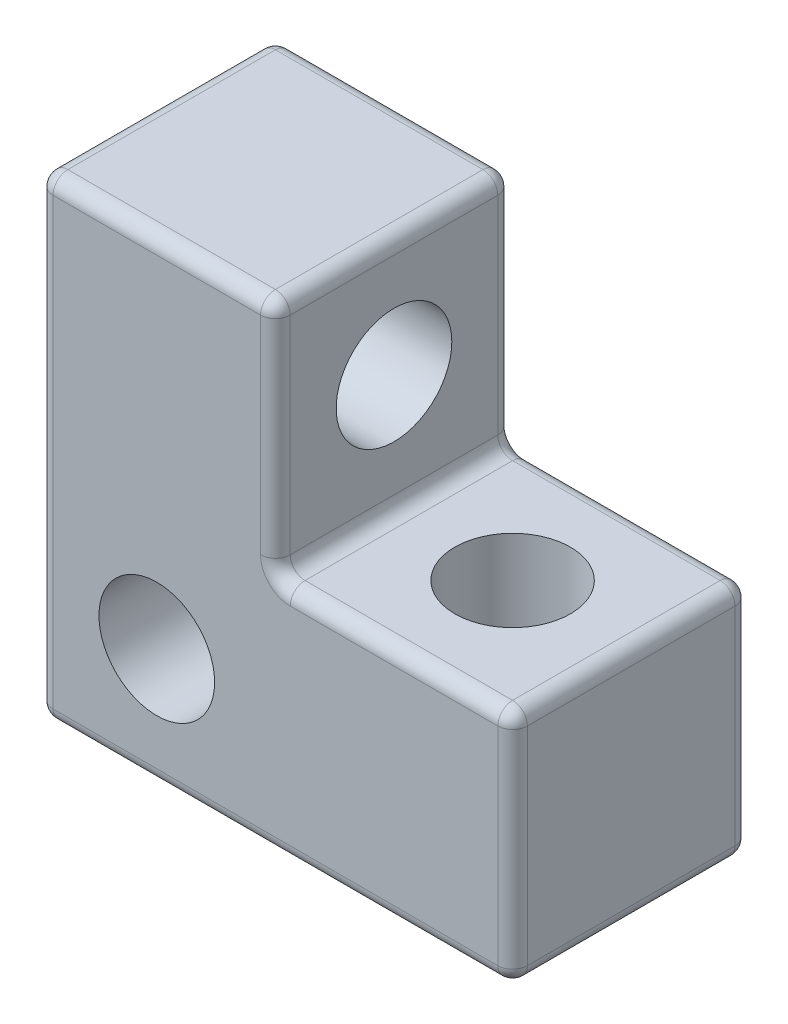
ISO-10303-21;
HEADER;
FILE_DESCRIPTION(('STEP AP214'),'2;1');
FILE_NAME('part.step','',(''),(''),'','','');
FILE_SCHEMA(('AUTOMOTIVE_DESIGN { 1 0 10303 214 1 1 1 1 }'));
ENDSEC;
DATA;
#1=APPLICATION_CONTEXT('core data for automotive mechanical design processes');
#2=APPLICATION_PROTOCOL_DEFINITION('international standard','automotive_design',2000,#1);
#3=PRODUCT_CONTEXT('',#1,'mechanical');
#4=PRODUCT('Part','Part','',(#3));
#5=PRODUCT_RELATED_PRODUCT_CATEGORY('part','',(#4));
#6=PRODUCT_DEFINITION_FORMATION('','',#4);
#7=PRODUCT_DEFINITION_CONTEXT('part definition',#1,'design');
#8=PRODUCT_DEFINITION('design','',#6,#7);
#9=PRODUCT_DEFINITION_SHAPE('','',#8);
#10=(LENGTH_UNIT() NAMED_UNIT(*) SI_UNIT(.MILLI.,.METRE.));
#11=(NAMED_UNIT(*) PLANE_ANGLE_UNIT() SI_UNIT($,.RADIAN.));
#12=(NAMED_UNIT(*) SI_UNIT($,.STERADIAN.) SOLID_ANGLE_UNIT());
#13=UNCERTAINTY_MEASURE_WITH_UNIT(LENGTH_MEASURE(1.E-05),#10,'distance_accuracy_value','');
#14=(GEOMETRIC_REPRESENTATION_CONTEXT(3) GLOBAL_UNCERTAINTY_ASSIGNED_CONTEXT((#13)) GLOBAL_UNIT_ASSIGNED_CONTEXT((#10,
#11,#12)) REPRESENTATION_CONTEXT('',''));
#15=CARTESIAN_POINT('',(0.,0.,0.));
#16=DIRECTION('',(0.,0.,1.));
#17=DIRECTION('',(1.,0.,0.));
#18=AXIS2_PLACEMENT_3D('',#15,#16,#17);
#19=CARTESIAN_POINT('',(0.,0.,8.));
#20=DIRECTION('',(0.,0.,-1.));
#21=DIRECTION('',(-1.,0.,0.));
#22=AXIS2_PLACEMENT_3D('',#19,#20,#21);
#23=PLANE('',#22);
#24=CARTESIAN_POINT('',(-4.,-4.,8.));
#25=DIRECTION('',(0.,0.,1.));
#26=DIRECTION('',(1.,0.,0.));
#27=AXIS2_PLACEMENT_3D('',#24,#25,#26);
#28=CIRCLE('',#27,1.95);
#29=CARTESIAN_POINT('',(-2.05,-4.,8.));
#30=VERTEX_POINT('',#29);
#31=EDGE_CURVE('E387',#30,#30,#28,.T.);
#32=ORIENTED_EDGE('',*,*,#31,.F.);
#33=EDGE_LOOP('',(#32));
#34=FACE_BOUND('',#33,.T.);
#35=CARTESIAN_POINT('',(0.5,0.5,8.));
#36=DIRECTION('',(0.,0.,-1.));
#37=DIRECTION('',(-1.,0.,0.));
#38=AXIS2_PLACEMENT_3D('',#35,#36,#37);
#39=CIRCLE('',#38,1.);
#40=CARTESIAN_POINT('',(-0.5,0.5,8.));
#41=VERTEX_POINT('',#40);
#42=CARTESIAN_POINT('',(0.5,-0.5,8.));
#43=VERTEX_POINT('',#42);
#44=EDGE_CURVE('E232',#41,#43,#39,.F.);
#45=ORIENTED_EDGE('',*,*,#44,.F.);
#46=DIRECTION('',(0.,1.,0.));
#47=VECTOR('',#46,1.);
#48=CARTESIAN_POINT('',(-0.5,0.,8.));
#49=LINE('',#48,#47);
#50=CARTESIAN_POINT('',(-0.5,7.5,8.));
#51=VERTEX_POINT('',#50);
#52=EDGE_CURVE('E230',#41,#51,#49,.T.);
#53=ORIENTED_EDGE('',*,*,#52,.T.);
#54=DIRECTION('',(-1.,0.,0.));
#55=VECTOR('',#54,1.);
#56=CARTESIAN_POINT('',(0.,7.5,8.));
#57=LINE('',#56,#55);
#58=CARTESIAN_POINT('',(-7.5,7.5,8.));
#59=VERTEX_POINT('',#58);
#60=EDGE_CURVE('E225',#51,#59,#57,.T.);
#61=ORIENTED_EDGE('',*,*,#60,.T.);
#62=DIRECTION('',(0.,-1.,0.));
#63=VECTOR('',#62,1.);
#64=CARTESIAN_POINT('',(-7.5,0.,8.));
#65=LINE('',#64,#63);
#66=CARTESIAN_POINT('',(-7.5,-7.5,8.));
#67=VERTEX_POINT('',#66);
#68=EDGE_CURVE('E221',#59,#67,#65,.T.);
#69=ORIENTED_EDGE('',*,*,#68,.T.);
#70=DIRECTION('',(1.,0.,0.));
#71=VECTOR('',#70,1.);
#72=CARTESIAN_POINT('',(0.,-7.5,8.));
#73=LINE('',#72,#71);
#74=CARTESIAN_POINT('',(7.5,-7.5,8.));
#75=VERTEX_POINT('',#74);
#76=EDGE_CURVE('E219',#67,#75,#73,.T.);
#77=ORIENTED_EDGE('',*,*,#76,.T.);
#78=DIRECTION('',(0.,1.,0.));
#79=VECTOR('',#78,1.);
#80=CARTESIAN_POINT('',(7.5,0.,8.));
#81=LINE('',#80,#79);
#82=CARTESIAN_POINT('',(7.5,-0.500000000000001,8.));
#83=VERTEX_POINT('',#82);
#84=EDGE_CURVE('E223',#75,#83,#81,.T.);
#85=ORIENTED_EDGE('',*,*,#84,.T.);
#86=DIRECTION('',(-1.,0.,0.));
#87=VECTOR('',#86,1.);
#88=CARTESIAN_POINT('',(0.,-0.5,8.));
#89=LINE('',#88,#87);
#90=EDGE_CURVE('E227',#83,#43,#89,.T.);
#91=ORIENTED_EDGE('',*,*,#90,.T.);
#92=EDGE_LOOP('',(#45,#53,#61,#69,#77,#85,#91));
#93=FACE_BOUND('',#92,.T.);
#94=ADVANCED_FACE('F33',(#34,#93),#23,.F.);
#95=CARTESIAN_POINT('',(8.,0.,8.));
#96=DIRECTION('',(0.,-1.,0.));
#97=DIRECTION('',(1.,0.,0.));
#98=AXIS2_PLACEMENT_3D('',#95,#96,#97);
#99=PLANE('',#98);
#100=DIRECTION('',(-1.,0.,0.));
#101=VECTOR('',#100,1.);
#102=CARTESIAN_POINT('',(8.,0.,7.5));
#103=LINE('',#102,#101);
#104=CARTESIAN_POINT('',(0.5,0.,7.5));
#105=VERTEX_POINT('',#104);
#106=CARTESIAN_POINT('',(7.5,0.,7.5));
#107=VERTEX_POINT('',#106);
#108=EDGE_CURVE('E194',#105,#107,#103,.F.);
#109=ORIENTED_EDGE('',*,*,#108,.T.);
#110=DIRECTION('',(0.,0.,-1.));
#111=VECTOR('',#110,1.);
#112=CARTESIAN_POINT('',(7.5,0.,8.));
#113=LINE('',#112,#111);
#114=CARTESIAN_POINT('',(7.5,0.,0.5));
#115=VERTEX_POINT('',#114);
#116=EDGE_CURVE('E200',#107,#115,#113,.T.);
#117=ORIENTED_EDGE('',*,*,#116,.T.);
#118=DIRECTION('',(-1.,0.,0.));
#119=VECTOR('',#118,1.);
#120=CARTESIAN_POINT('',(0.,0.,0.5));
#121=LINE('',#120,#119);
#122=CARTESIAN_POINT('',(0.5,0.,0.5));
#123=VERTEX_POINT('',#122);
#124=EDGE_CURVE('E169',#115,#123,#121,.T.);
#125=ORIENTED_EDGE('',*,*,#124,.T.);
#126=DIRECTION('',(0.,0.,-1.));
#127=VECTOR('',#126,1.);
#128=CARTESIAN_POINT('',(0.5,0.,8.));
#129=LINE('',#128,#127);
#130=EDGE_CURVE('E188',#123,#105,#129,.F.);
#131=ORIENTED_EDGE('',*,*,#130,.T.);
#132=EDGE_LOOP('',(#109,#117,#125,#131));
#133=FACE_BOUND('',#132,.T.);
#134=CARTESIAN_POINT('',(4.,0.,4.));
#135=DIRECTION('',(0.,1.,0.));
#136=DIRECTION('',(0.,0.,1.));
#137=AXIS2_PLACEMENT_3D('',#134,#135,#136);
#138=CIRCLE('',#137,1.95);
#139=CARTESIAN_POINT('',(4.,0.,5.95));
#140=VERTEX_POINT('',#139);
#141=EDGE_CURVE('E399',#140,#140,#138,.T.);
#142=ORIENTED_EDGE('',*,*,#141,.F.);
#143=EDGE_LOOP('',(#142));
#144=FACE_BOUND('',#143,.T.);
#145=ADVANCED_FACE('F197',(#133,#144),#99,.F.);
#146=CARTESIAN_POINT('',(0.,0.,8.));
#147=DIRECTION('',(-1.,0.,0.));
#148=DIRECTION('',(0.,0.,1.));
#149=AXIS2_PLACEMENT_3D('',#146,#147,#148);
#150=PLANE('',#149);
#151=DIRECTION('',(0.,1.,0.));
#152=VECTOR('',#151,1.);
#153=CARTESIAN_POINT('',(0.,8.,0.5));
#154=LINE('',#153,#152);
#155=CARTESIAN_POINT('',(0.,0.5,0.5));
#156=VERTEX_POINT('',#155);
#157=CARTESIAN_POINT('',(0.,7.5,0.5));
#158=VERTEX_POINT('',#157);
#159=EDGE_CURVE('E247',#156,#158,#154,.T.);
#160=ORIENTED_EDGE('',*,*,#159,.T.);
#161=DIRECTION('',(0.,0.,-1.));
#162=VECTOR('',#161,1.);
#163=CARTESIAN_POINT('',(0.,7.5,8.));
#164=LINE('',#163,#162);
#165=CARTESIAN_POINT('',(0.,7.5,7.5));
#166=VERTEX_POINT('',#165);
#167=EDGE_CURVE('E249',#158,#166,#164,.F.);
#168=ORIENTED_EDGE('',*,*,#167,.T.);
#169=DIRECTION('',(0.,1.,0.));
#170=VECTOR('',#169,1.);
#171=CARTESIAN_POINT('',(0.,0.,7.5));
#172=LINE('',#171,#170);
#173=CARTESIAN_POINT('',(0.,0.5,7.5));
#174=VERTEX_POINT('',#173);
#175=EDGE_CURVE('E245',#166,#174,#172,.F.);
#176=ORIENTED_EDGE('',*,*,#175,.T.);
#177=DIRECTION('',(0.,0.,-1.));
#178=VECTOR('',#177,1.);
#179=CARTESIAN_POINT('',(0.,0.5,0.));
#180=LINE('',#179,#178);
#181=EDGE_CURVE('E243',#174,#156,#180,.T.);
#182=ORIENTED_EDGE('',*,*,#181,.T.);
#183=EDGE_LOOP('',(#160,#168,#176,#182));
#184=FACE_BOUND('',#183,.T.);
#185=CARTESIAN_POINT('',(0.,4.,4.));
#186=DIRECTION('',(1.,0.,0.));
#187=DIRECTION('',(0.,0.,-1.));
#188=AXIS2_PLACEMENT_3D('',#185,#186,#187);
#189=CIRCLE('',#188,1.95);
#190=CARTESIAN_POINT('',(0.,4.,2.05));
#191=VERTEX_POINT('',#190);
#192=EDGE_CURVE('E393',#191,#191,#189,.T.);
#193=ORIENTED_EDGE('',*,*,#192,.F.);
#194=EDGE_LOOP('',(#193));
#195=FACE_BOUND('',#194,.T.);
#196=ADVANCED_FACE('F434',(#184,#195),#150,.F.);
#197=CARTESIAN_POINT('',(0.,8.,8.));
#198=DIRECTION('',(0.,-1.,0.));
#199=DIRECTION('',(1.,0.,0.));
#200=AXIS2_PLACEMENT_3D('',#197,#198,#199);
#201=PLANE('',#200);
#202=DIRECTION('',(-1.,0.,0.));
#203=VECTOR('',#202,1.);
#204=CARTESIAN_POINT('',(0.,8.,7.5));
#205=LINE('',#204,#203);
#206=CARTESIAN_POINT('',(-7.5,8.,7.5));
#207=VERTEX_POINT('',#206);
#208=CARTESIAN_POINT('',(-0.5,8.,7.5));
#209=VERTEX_POINT('',#208);
#210=EDGE_CURVE('E238',#207,#209,#205,.F.);
#211=ORIENTED_EDGE('',*,*,#210,.T.);
#212=DIRECTION('',(0.,0.,-1.));
#213=VECTOR('',#212,1.);
#214=CARTESIAN_POINT('',(-0.5,8.,8.));
#215=LINE('',#214,#213);
#216=CARTESIAN_POINT('',(-0.5,8.,0.5));
#217=VERTEX_POINT('',#216);
#218=EDGE_CURVE('E240',#209,#217,#215,.T.);
#219=ORIENTED_EDGE('',*,*,#218,.T.);
#220=DIRECTION('',(-1.,0.,0.));
#221=VECTOR('',#220,1.);
#222=CARTESIAN_POINT('',(-8.,8.,0.5));
#223=LINE('',#222,#221);
#224=CARTESIAN_POINT('',(-7.5,8.,0.5));
#225=VERTEX_POINT('',#224);
#226=EDGE_CURVE('E234',#217,#225,#223,.T.);
#227=ORIENTED_EDGE('',*,*,#226,.T.);
#228=DIRECTION('',(0.,0.,-1.));
#229=VECTOR('',#228,1.);
#230=CARTESIAN_POINT('',(-7.5,8.,8.));
#231=LINE('',#230,#229);
#232=EDGE_CURVE('E236',#225,#207,#231,.F.);
#233=ORIENTED_EDGE('',*,*,#232,.T.);
#234=EDGE_LOOP('',(#211,#219,#227,#233));
#235=FACE_BOUND('',#234,.T.);
#236=ADVANCED_FACE('F456',(#235),#201,.F.);
#237=CARTESIAN_POINT('',(-8.,8.,8.));
#238=DIRECTION('',(1.,0.,0.));
#239=DIRECTION('',(0.,1.,0.));
#240=AXIS2_PLACEMENT_3D('',#237,#238,#239);
#241=PLANE('',#240);
#242=DIRECTION('',(0.,0.,-1.));
#243=VECTOR('',#242,1.);
#244=CARTESIAN_POINT('',(-8.,7.5,8.));
#245=LINE('',#244,#243);
#246=CARTESIAN_POINT('',(-8.,7.5,7.5));
#247=VERTEX_POINT('',#246);
#248=CARTESIAN_POINT('',(-8.,7.5,0.5));
#249=VERTEX_POINT('',#248);
#250=EDGE_CURVE('E256',#247,#249,#245,.T.);
#251=ORIENTED_EDGE('',*,*,#250,.T.);
#252=DIRECTION('',(0.,-1.,0.));
#253=VECTOR('',#252,1.);
#254=CARTESIAN_POINT('',(-8.,-8.,0.5));
#255=LINE('',#254,#253);
#256=CARTESIAN_POINT('',(-8.,-7.5,0.5));
#257=VERTEX_POINT('',#256);
#258=EDGE_CURVE('E259',#249,#257,#255,.T.);
#259=ORIENTED_EDGE('',*,*,#258,.T.);
#260=DIRECTION('',(0.,0.,-1.));
#261=VECTOR('',#260,1.);
#262=CARTESIAN_POINT('',(-8.,-7.5,8.));
#263=LINE('',#262,#261);
#264=CARTESIAN_POINT('',(-8.,-7.5,7.5));
#265=VERTEX_POINT('',#264);
#266=EDGE_CURVE('E254',#257,#265,#263,.F.);
#267=ORIENTED_EDGE('',*,*,#266,.T.);
#268=DIRECTION('',(0.,-1.,0.));
#269=VECTOR('',#268,1.);
#270=CARTESIAN_POINT('',(-8.,8.,7.5));
#271=LINE('',#270,#269);
#272=EDGE_CURVE('E252',#265,#247,#271,.F.);
#273=ORIENTED_EDGE('',*,*,#272,.T.);
#274=EDGE_LOOP('',(#251,#259,#267,#273));
#275=FACE_BOUND('',#274,.T.);
#276=CARTESIAN_POINT('',(-8.,4.,4.));
#277=DIRECTION('',(1.,0.,0.));
#278=DIRECTION('',(0.,0.,-1.));
#279=AXIS2_PLACEMENT_3D('',#276,#277,#278);
#280=CIRCLE('',#279,1.7);
#281=CARTESIAN_POINT('',(-8.,4.,2.3));
#282=VERTEX_POINT('',#281);
#283=EDGE_CURVE('E377',#282,#282,#280,.T.);
#284=ORIENTED_EDGE('',*,*,#283,.T.);
#285=EDGE_LOOP('',(#284));
#286=FACE_BOUND('',#285,.T.);
#287=ADVANCED_FACE('F453',(#275,#286),#241,.F.);
#288=CARTESIAN_POINT('',(-8.,-8.,8.));
#289=DIRECTION('',(0.,1.,0.));
#290=DIRECTION('',(0.,0.,1.));
#291=AXIS2_PLACEMENT_3D('',#288,#289,#290);
#292=PLANE('',#291);
#293=DIRECTION('',(0.,0.,-1.));
#294=VECTOR('',#293,1.);
#295=CARTESIAN_POINT('',(-7.5,-8.,8.));
#296=LINE('',#295,#294);
#297=CARTESIAN_POINT('',(-7.5,-8.,7.5));
#298=VERTEX_POINT('',#297);
#299=CARTESIAN_POINT('',(-7.5,-8.,0.5));
#300=VERTEX_POINT('',#299);
#301=EDGE_CURVE('E53',#298,#300,#296,.T.);
#302=ORIENTED_EDGE('',*,*,#301,.T.);
#303=DIRECTION('',(1.,0.,0.));
#304=VECTOR('',#303,1.);
#305=CARTESIAN_POINT('',(8.,-8.,0.5));
#306=LINE('',#305,#304);
#307=CARTESIAN_POINT('',(7.5,-8.,0.5));
#308=VERTEX_POINT('',#307);
#309=EDGE_CURVE('E11',#300,#308,#306,.T.);
#310=ORIENTED_EDGE('',*,*,#309,.T.);
#311=DIRECTION('',(0.,0.,-1.));
#312=VECTOR('',#311,1.);
#313=CARTESIAN_POINT('',(7.5,-8.,8.));
#314=LINE('',#313,#312);
#315=CARTESIAN_POINT('',(7.5,-8.,7.5));
#316=VERTEX_POINT('',#315);
#317=EDGE_CURVE('E42',#308,#316,#314,.F.);
#318=ORIENTED_EDGE('',*,*,#317,.T.);
#319=DIRECTION('',(1.,0.,0.));
#320=VECTOR('',#319,1.);
#321=CARTESIAN_POINT('',(-8.,-8.,7.5));
#322=LINE('',#321,#320);
#323=EDGE_CURVE('E270',#316,#298,#322,.F.);
#324=ORIENTED_EDGE('',*,*,#323,.T.);
#325=EDGE_LOOP('',(#302,#310,#318,#324));
#326=FACE_BOUND('',#325,.T.);
#327=CARTESIAN_POINT('',(4.,-8.,4.));
#328=DIRECTION('',(0.,1.,0.));
#329=DIRECTION('',(0.,0.,1.));
#330=AXIS2_PLACEMENT_3D('',#327,#328,#329);
#331=CIRCLE('',#330,1.7);
#332=CARTESIAN_POINT('',(4.,-8.,5.7));
#333=VERTEX_POINT('',#332);
#334=EDGE_CURVE('E383',#333,#333,#331,.T.);
#335=ORIENTED_EDGE('',*,*,#334,.T.);
#336=EDGE_LOOP('',(#335));
#337=FACE_BOUND('',#336,.T.);
#338=ADVANCED_FACE('F449',(#326,#337),#292,.F.);
#339=CARTESIAN_POINT('',(8.,-8.,8.));
#340=DIRECTION('',(-1.,0.,0.));
#341=DIRECTION('',(0.,0.,1.));
#342=AXIS2_PLACEMENT_3D('',#339,#340,#341);
#343=PLANE('',#342);
#344=DIRECTION('',(0.,1.,0.));
#345=VECTOR('',#344,1.);
#346=CARTESIAN_POINT('',(8.,-8.,7.5));
#347=LINE('',#346,#345);
#348=CARTESIAN_POINT('',(8.,-0.500000000000001,7.5));
#349=VERTEX_POINT('',#348);
#350=CARTESIAN_POINT('',(8.,-7.5,7.5));
#351=VERTEX_POINT('',#350);
#352=EDGE_CURVE('E265',#349,#351,#347,.F.);
#353=ORIENTED_EDGE('',*,*,#352,.T.);
#354=DIRECTION('',(0.,0.,-1.));
#355=VECTOR('',#354,1.);
#356=CARTESIAN_POINT('',(8.,-7.5,8.));
#357=LINE('',#356,#355);
#358=CARTESIAN_POINT('',(8.,-7.5,0.5));
#359=VERTEX_POINT('',#358);
#360=EDGE_CURVE('E267',#351,#359,#357,.T.);
#361=ORIENTED_EDGE('',*,*,#360,.T.);
#362=DIRECTION('',(0.,1.,0.));
#363=VECTOR('',#362,1.);
#364=CARTESIAN_POINT('',(8.,0.,0.5));
#365=LINE('',#364,#363);
#366=CARTESIAN_POINT('',(8.,-0.500000000000001,0.5));
#367=VERTEX_POINT('',#366);
#368=EDGE_CURVE('E261',#359,#367,#365,.T.);
#369=ORIENTED_EDGE('',*,*,#368,.T.);
#370=DIRECTION('',(0.,0.,-1.));
#371=VECTOR('',#370,1.);
#372=CARTESIAN_POINT('',(8.,-0.5,8.));
#373=LINE('',#372,#371);
#374=EDGE_CURVE('E263',#367,#349,#373,.F.);
#375=ORIENTED_EDGE('',*,*,#374,.T.);
#376=EDGE_LOOP('',(#353,#361,#369,#375));
#377=FACE_BOUND('',#376,.T.);
#378=ADVANCED_FACE('F445',(#377),#343,.F.);
#379=CARTESIAN_POINT('',(0.,0.,0.));
#380=DIRECTION('',(0.,0.,-1.));
#381=DIRECTION('',(-1.,0.,0.));
#382=AXIS2_PLACEMENT_3D('',#379,#380,#381);
#383=PLANE('',#382);
#384=DIRECTION('',(-1.,0.,0.));
#385=VECTOR('',#384,1.);
#386=CARTESIAN_POINT('',(0.,7.5,0.));
#387=LINE('',#386,#385);
#388=CARTESIAN_POINT('',(-7.5,7.5,0.));
#389=VERTEX_POINT('',#388);
#390=CARTESIAN_POINT('',(-0.5,7.5,0.));
#391=VERTEX_POINT('',#390);
#392=EDGE_CURVE('E212',#389,#391,#387,.F.);
#393=ORIENTED_EDGE('',*,*,#392,.T.);
#394=DIRECTION('',(0.,1.,0.));
#395=VECTOR('',#394,1.);
#396=CARTESIAN_POINT('',(-0.5,0.,0.));
#397=LINE('',#396,#395);
#398=CARTESIAN_POINT('',(-0.5,0.5,0.));
#399=VERTEX_POINT('',#398);
#400=EDGE_CURVE('E217',#391,#399,#397,.F.);
#401=ORIENTED_EDGE('',*,*,#400,.T.);
#402=CARTESIAN_POINT('',(0.5,0.5,0.));
#403=DIRECTION('',(0.,0.,-1.));
#404=DIRECTION('',(-1.,0.,0.));
#405=AXIS2_PLACEMENT_3D('',#402,#403,#404);
#406=CIRCLE('',#405,1.);
#407=CARTESIAN_POINT('',(0.5,-0.5,0.));
#408=VERTEX_POINT('',#407);
#409=EDGE_CURVE('E215',#408,#399,#406,.T.);
#410=ORIENTED_EDGE('',*,*,#409,.F.);
#411=DIRECTION('',(-1.,0.,0.));
#412=VECTOR('',#411,1.);
#413=CARTESIAN_POINT('',(8.,-0.500000000000001,0.));
#414=LINE('',#413,#412);
#415=CARTESIAN_POINT('',(7.5,-0.500000000000001,0.));
#416=VERTEX_POINT('',#415);
#417=EDGE_CURVE('E171',#408,#416,#414,.F.);
#418=ORIENTED_EDGE('',*,*,#417,.T.);
#419=DIRECTION('',(0.,1.,0.));
#420=VECTOR('',#419,1.);
#421=CARTESIAN_POINT('',(7.5,-8.,0.));
#422=LINE('',#421,#420);
#423=CARTESIAN_POINT('',(7.5,-7.5,0.));
#424=VERTEX_POINT('',#423);
#425=EDGE_CURVE('E210',#416,#424,#422,.F.);
#426=ORIENTED_EDGE('',*,*,#425,.T.);
#427=DIRECTION('',(1.,0.,0.));
#428=VECTOR('',#427,1.);
#429=CARTESIAN_POINT('',(-8.,-7.5,0.));
#430=LINE('',#429,#428);
#431=CARTESIAN_POINT('',(-7.5,-7.5,0.));
#432=VERTEX_POINT('',#431);
#433=EDGE_CURVE('E203',#424,#432,#430,.F.);
#434=ORIENTED_EDGE('',*,*,#433,.T.);
#435=DIRECTION('',(0.,-1.,0.));
#436=VECTOR('',#435,1.);
#437=CARTESIAN_POINT('',(-7.5,8.,0.));
#438=LINE('',#437,#436);
#439=EDGE_CURVE('E208',#432,#389,#438,.F.);
#440=ORIENTED_EDGE('',*,*,#439,.T.);
#441=EDGE_LOOP('',(#393,#401,#410,#418,#426,#434,#440));
#442=FACE_BOUND('',#441,.T.);
#443=CARTESIAN_POINT('',(-4.,-4.,0.));
#444=DIRECTION('',(0.,0.,1.));
#445=DIRECTION('',(1.,0.,0.));
#446=AXIS2_PLACEMENT_3D('',#443,#444,#445);
#447=CIRCLE('',#446,1.7);
#448=CARTESIAN_POINT('',(-2.3,-4.,0.));
#449=VERTEX_POINT('',#448);
#450=EDGE_CURVE('E366',#449,#449,#447,.T.);
#451=ORIENTED_EDGE('',*,*,#450,.T.);
#452=EDGE_LOOP('',(#451));
#453=FACE_BOUND('',#452,.T.);
#454=ADVANCED_FACE('F442',(#442,#453),#383,.T.);
#455=CARTESIAN_POINT('',(4.,-6.,4.));
#456=DIRECTION('',(0.,1.,0.));
#457=DIRECTION('',(0.,0.,1.));
#458=AXIS2_PLACEMENT_3D('',#455,#456,#457);
#459=CONICAL_SURFACE('',#458,1.95,0.785398163397448);
#460=CARTESIAN_POINT('',(4.,-6.25,4.));
#461=DIRECTION('',(0.,1.,0.));
#462=DIRECTION('',(0.,0.,1.));
#463=AXIS2_PLACEMENT_3D('',#460,#461,#462);
#464=CIRCLE('',#463,1.7);
#465=CARTESIAN_POINT('',(4.,-6.25,5.7));
#466=VERTEX_POINT('',#465);
#467=EDGE_CURVE('E386',#466,#466,#464,.F.);
#468=ORIENTED_EDGE('',*,*,#467,.T.);
#469=EDGE_LOOP('',(#468));
#470=FACE_BOUND('',#469,.T.);
#471=CARTESIAN_POINT('',(4.,-6.,4.));
#472=DIRECTION('',(0.,1.,0.));
#473=DIRECTION('',(0.,0.,1.));
#474=AXIS2_PLACEMENT_3D('',#471,#472,#473);
#475=CIRCLE('',#474,1.95);
#476=CARTESIAN_POINT('',(4.,-6.,5.95));
#477=VERTEX_POINT('',#476);
#478=EDGE_CURVE('E195',#477,#477,#475,.T.);
#479=ORIENTED_EDGE('',*,*,#478,.T.);
#480=EDGE_LOOP('',(#479));
#481=FACE_BOUND('',#480,.T.);
#482=ADVANCED_FACE('F440',(#470,#481),#459,.F.);
#483=CARTESIAN_POINT('',(4.,0.,4.));
#484=DIRECTION('',(0.,1.,0.));
#485=DIRECTION('',(0.,0.,1.));
#486=AXIS2_PLACEMENT_3D('',#483,#484,#485);
#487=CYLINDRICAL_SURFACE('',#486,1.95);
#488=ORIENTED_EDGE('',*,*,#478,.F.);
#489=EDGE_LOOP('',(#488));
#490=FACE_BOUND('',#489,.T.);
#491=ORIENTED_EDGE('',*,*,#141,.T.);
#492=EDGE_LOOP('',(#491));
#493=FACE_BOUND('',#492,.T.);
#494=ADVANCED_FACE('F607',(#490,#493),#487,.F.);
#495=CARTESIAN_POINT('',(-6.,4.,4.));
#496=DIRECTION('',(1.,0.,0.));
#497=DIRECTION('',(0.,0.,-1.));
#498=AXIS2_PLACEMENT_3D('',#495,#496,#497);
#499=CONICAL_SURFACE('',#498,1.95,0.785398163397447);
#500=CARTESIAN_POINT('',(-6.25,4.,4.));
#501=DIRECTION('',(1.,0.,0.));
#502=DIRECTION('',(0.,0.,-1.));
#503=AXIS2_PLACEMENT_3D('',#500,#501,#502);
#504=CIRCLE('',#503,1.7);
#505=CARTESIAN_POINT('',(-6.25,4.,2.3));
#506=VERTEX_POINT('',#505);
#507=EDGE_CURVE('E382',#506,#506,#504,.F.);
#508=ORIENTED_EDGE('',*,*,#507,.T.);
#509=EDGE_LOOP('',(#508));
#510=FACE_BOUND('',#509,.T.);
#511=CARTESIAN_POINT('',(-6.,4.,4.));
#512=DIRECTION('',(1.,0.,0.));
#513=DIRECTION('',(0.,0.,-1.));
#514=AXIS2_PLACEMENT_3D('',#511,#512,#513);
#515=CIRCLE('',#514,1.95);
#516=CARTESIAN_POINT('',(-6.,4.,2.05));
#517=VERTEX_POINT('',#516);
#518=EDGE_CURVE('E396',#517,#517,#515,.T.);
#519=ORIENTED_EDGE('',*,*,#518,.T.);
#520=EDGE_LOOP('',(#519));
#521=FACE_BOUND('',#520,.T.);
#522=ADVANCED_FACE('F409',(#510,#521),#499,.F.);
#523=CARTESIAN_POINT('',(0.,4.,4.));
#524=DIRECTION('',(1.,0.,0.));
#525=DIRECTION('',(0.,0.,-1.));
#526=AXIS2_PLACEMENT_3D('',#523,#524,#525);
#527=CYLINDRICAL_SURFACE('',#526,1.95);
#528=ORIENTED_EDGE('',*,*,#518,.F.);
#529=EDGE_LOOP('',(#528));
#530=FACE_BOUND('',#529,.T.);
#531=ORIENTED_EDGE('',*,*,#192,.T.);
#532=EDGE_LOOP('',(#531));
#533=FACE_BOUND('',#532,.T.);
#534=ADVANCED_FACE('F616',(#530,#533),#527,.F.);
#535=CARTESIAN_POINT('',(-4.,-4.,2.));
#536=DIRECTION('',(0.,0.,1.));
#537=DIRECTION('',(1.,0.,0.));
#538=AXIS2_PLACEMENT_3D('',#535,#536,#537);
#539=CONICAL_SURFACE('',#538,1.95,0.785398163397447);
#540=CARTESIAN_POINT('',(-4.,-4.,1.75));
#541=DIRECTION('',(0.,0.,1.));
#542=DIRECTION('',(1.,0.,0.));
#543=AXIS2_PLACEMENT_3D('',#540,#541,#542);
#544=CIRCLE('',#543,1.7);
#545=CARTESIAN_POINT('',(-2.3,-4.,1.75));
#546=VERTEX_POINT('',#545);
#547=EDGE_CURVE('E372',#546,#546,#544,.F.);
#548=ORIENTED_EDGE('',*,*,#547,.T.);
#549=EDGE_LOOP('',(#548));
#550=FACE_BOUND('',#549,.T.);
#551=CARTESIAN_POINT('',(-4.,-4.,2.));
#552=DIRECTION('',(0.,0.,1.));
#553=DIRECTION('',(1.,0.,0.));
#554=AXIS2_PLACEMENT_3D('',#551,#552,#553);
#555=CIRCLE('',#554,1.95);
#556=CARTESIAN_POINT('',(-2.05,-4.,2.));
#557=VERTEX_POINT('',#556);
#558=EDGE_CURVE('E390',#557,#557,#555,.T.);
#559=ORIENTED_EDGE('',*,*,#558,.T.);
#560=EDGE_LOOP('',(#559));
#561=FACE_BOUND('',#560,.T.);
#562=ADVANCED_FACE('F621',(#550,#561),#539,.F.);
#563=CARTESIAN_POINT('',(-4.,-4.,8.));
#564=DIRECTION('',(0.,0.,1.));
#565=DIRECTION('',(1.,0.,0.));
#566=AXIS2_PLACEMENT_3D('',#563,#564,#565);
#567=CYLINDRICAL_SURFACE('',#566,1.95);
#568=ORIENTED_EDGE('',*,*,#558,.F.);
#569=EDGE_LOOP('',(#568));
#570=FACE_BOUND('',#569,.T.);
#571=ORIENTED_EDGE('',*,*,#31,.T.);
#572=EDGE_LOOP('',(#571));
#573=FACE_BOUND('',#572,.T.);
#574=ADVANCED_FACE('F424',(#570,#573),#567,.F.);
#575=CARTESIAN_POINT('',(4.,0.,4.));
#576=DIRECTION('',(0.,1.,0.));
#577=DIRECTION('',(0.,0.,1.));
#578=AXIS2_PLACEMENT_3D('',#575,#576,#577);
#579=CYLINDRICAL_SURFACE('',#578,1.7);
#580=ORIENTED_EDGE('',*,*,#334,.F.);
#581=EDGE_LOOP('',(#580));
#582=FACE_BOUND('',#581,.T.);
#583=ORIENTED_EDGE('',*,*,#467,.F.);
#584=EDGE_LOOP('',(#583));
#585=FACE_BOUND('',#584,.T.);
#586=ADVANCED_FACE('F415',(#582,#585),#579,.F.);
#587=CARTESIAN_POINT('',(0.,4.,4.));
#588=DIRECTION('',(1.,0.,0.));
#589=DIRECTION('',(0.,0.,-1.));
#590=AXIS2_PLACEMENT_3D('',#587,#588,#589);
#591=CYLINDRICAL_SURFACE('',#590,1.7);
#592=ORIENTED_EDGE('',*,*,#283,.F.);
#593=EDGE_LOOP('',(#592));
#594=FACE_BOUND('',#593,.T.);
#595=ORIENTED_EDGE('',*,*,#507,.F.);
#596=EDGE_LOOP('',(#595));
#597=FACE_BOUND('',#596,.T.);
#598=ADVANCED_FACE('F412',(#594,#597),#591,.F.);
#599=CARTESIAN_POINT('',(-4.,-4.,8.));
#600=DIRECTION('',(0.,0.,1.));
#601=DIRECTION('',(1.,0.,0.));
#602=AXIS2_PLACEMENT_3D('',#599,#600,#601);
#603=CYLINDRICAL_SURFACE('',#602,1.7);
#604=ORIENTED_EDGE('',*,*,#450,.F.);
#605=EDGE_LOOP('',(#604));
#606=FACE_BOUND('',#605,.T.);
#607=ORIENTED_EDGE('',*,*,#547,.F.);
#608=EDGE_LOOP('',(#607));
#609=FACE_BOUND('',#608,.T.);
#610=ADVANCED_FACE('F414',(#606,#609),#603,.F.);
#611=CARTESIAN_POINT('',(-7.5,0.,7.5));
#612=DIRECTION('',(0.,-1.,0.));
#613=DIRECTION('',(1.,0.,0.));
#614=AXIS2_PLACEMENT_3D('',#611,#612,#613);
#615=CYLINDRICAL_SURFACE('',#614,0.5);
#616=CARTESIAN_POINT('',(-7.5,-7.5,7.5));
#617=DIRECTION('',(0.,-1.,0.));
#618=DIRECTION('',(0.,0.,-1.));
#619=AXIS2_PLACEMENT_3D('',#616,#617,#618);
#620=CIRCLE('',#619,0.5);
#621=EDGE_CURVE('E37',#67,#265,#620,.T.);
#622=ORIENTED_EDGE('',*,*,#621,.F.);
#623=ORIENTED_EDGE('',*,*,#68,.F.);
#624=CARTESIAN_POINT('',(-7.5,7.5,7.5));
#625=DIRECTION('',(0.,1.,0.));
#626=DIRECTION('',(0.,0.,1.));
#627=AXIS2_PLACEMENT_3D('',#624,#625,#626);
#628=CIRCLE('',#627,0.5);
#629=EDGE_CURVE('E359',#247,#59,#628,.T.);
#630=ORIENTED_EDGE('',*,*,#629,.F.);
#631=ORIENTED_EDGE('',*,*,#272,.F.);
#632=EDGE_LOOP('',(#622,#623,#630,#631));
#633=FACE_BOUND('',#632,.T.);
#634=ADVANCED_FACE('F35',(#633),#615,.T.);
#635=CARTESIAN_POINT('',(-7.5,-7.5,7.5));
#636=DIRECTION('',(-1.,0.,0.));
#637=DIRECTION('',(0.,0.,1.));
#638=AXIS2_PLACEMENT_3D('',#635,#636,#637);
#639=SPHERICAL_SURFACE('',#638,0.5);
#640=CARTESIAN_POINT('',(-7.5,-7.5,7.5));
#641=DIRECTION('',(-1.,0.,0.));
#642=DIRECTION('',(0.,0.,1.));
#643=AXIS2_PLACEMENT_3D('',#640,#641,#642);
#644=CIRCLE('',#643,0.5);
#645=EDGE_CURVE('E354',#67,#298,#644,.F.);
#646=ORIENTED_EDGE('',*,*,#645,.F.);
#647=ORIENTED_EDGE('',*,*,#621,.T.);
#648=CARTESIAN_POINT('',(-7.5,-7.5,7.5));
#649=DIRECTION('',(0.,0.,1.));
#650=DIRECTION('',(1.,0.,0.));
#651=AXIS2_PLACEMENT_3D('',#648,#649,#650);
#652=CIRCLE('',#651,0.5);
#653=EDGE_CURVE('E357',#298,#265,#652,.F.);
#654=ORIENTED_EDGE('',*,*,#653,.F.);
#655=EDGE_LOOP('',(#646,#647,#654));
#656=FACE_BOUND('',#655,.T.);
#657=ADVANCED_FACE('F568',(#656),#639,.T.);
#658=CARTESIAN_POINT('',(-7.5,7.5,7.5));
#659=DIRECTION('',(0.,0.,1.));
#660=DIRECTION('',(1.,0.,0.));
#661=AXIS2_PLACEMENT_3D('',#658,#659,#660);
#662=SPHERICAL_SURFACE('',#661,0.5);
#663=CARTESIAN_POINT('',(-7.5,7.5,7.5));
#664=DIRECTION('',(0.,0.,1.));
#665=DIRECTION('',(1.,0.,0.));
#666=AXIS2_PLACEMENT_3D('',#663,#664,#665);
#667=CIRCLE('',#666,0.5);
#668=EDGE_CURVE('E348',#247,#207,#667,.F.);
#669=ORIENTED_EDGE('',*,*,#668,.F.);
#670=ORIENTED_EDGE('',*,*,#629,.T.);
#671=CARTESIAN_POINT('',(-7.5,7.5,7.5));
#672=DIRECTION('',(-1.,0.,0.));
#673=DIRECTION('',(0.,0.,1.));
#674=AXIS2_PLACEMENT_3D('',#671,#672,#673);
#675=CIRCLE('',#674,0.5);
#676=EDGE_CURVE('E351',#207,#59,#675,.F.);
#677=ORIENTED_EDGE('',*,*,#676,.F.);
#678=EDGE_LOOP('',(#669,#670,#677));
#679=FACE_BOUND('',#678,.T.);
#680=ADVANCED_FACE('F565',(#679),#662,.T.);
#681=CARTESIAN_POINT('',(-7.5,-7.5,8.));
#682=DIRECTION('',(0.,0.,-1.));
#683=DIRECTION('',(-1.,0.,0.));
#684=AXIS2_PLACEMENT_3D('',#681,#682,#683);
#685=CYLINDRICAL_SURFACE('',#684,0.5);
#686=ORIENTED_EDGE('',*,*,#653,.T.);
#687=ORIENTED_EDGE('',*,*,#266,.F.);
#688=CARTESIAN_POINT('',(-7.5,-7.5,0.5));
#689=DIRECTION('',(0.,0.,-1.));
#690=DIRECTION('',(-1.,0.,0.));
#691=AXIS2_PLACEMENT_3D('',#688,#689,#690);
#692=CIRCLE('',#691,0.5);
#693=EDGE_CURVE('E342',#300,#257,#692,.T.);
#694=ORIENTED_EDGE('',*,*,#693,.F.);
#695=ORIENTED_EDGE('',*,*,#301,.F.);
#696=EDGE_LOOP('',(#686,#687,#694,#695));
#697=FACE_BOUND('',#696,.T.);
#698=ADVANCED_FACE('F561',(#697),#685,.T.);
#699=CARTESIAN_POINT('',(0.,-7.5,7.5));
#700=DIRECTION('',(1.,0.,0.));
#701=DIRECTION('',(0.,0.,-1.));
#702=AXIS2_PLACEMENT_3D('',#699,#700,#701);
#703=CYLINDRICAL_SURFACE('',#702,0.5);
#704=ORIENTED_EDGE('',*,*,#645,.T.);
#705=ORIENTED_EDGE('',*,*,#323,.F.);
#706=CARTESIAN_POINT('',(7.5,-7.5,7.5));
#707=DIRECTION('',(1.,0.,0.));
#708=DIRECTION('',(0.,0.,-1.));
#709=AXIS2_PLACEMENT_3D('',#706,#707,#708);
#710=CIRCLE('',#709,0.5);
#711=EDGE_CURVE('E339',#75,#316,#710,.T.);
#712=ORIENTED_EDGE('',*,*,#711,.F.);
#713=ORIENTED_EDGE('',*,*,#76,.F.);
#714=EDGE_LOOP('',(#704,#705,#712,#713));
#715=FACE_BOUND('',#714,.T.);
#716=ADVANCED_FACE('F557',(#715),#703,.T.);
#717=CARTESIAN_POINT('',(0.,7.5,7.5));
#718=DIRECTION('',(-1.,0.,0.));
#719=DIRECTION('',(0.,-1.,0.));
#720=AXIS2_PLACEMENT_3D('',#717,#718,#719);
#721=CYLINDRICAL_SURFACE('',#720,0.5);
#722=ORIENTED_EDGE('',*,*,#676,.T.);
#723=ORIENTED_EDGE('',*,*,#60,.F.);
#724=CARTESIAN_POINT('',(-0.5,7.5,7.5));
#725=DIRECTION('',(1.,0.,0.));
#726=DIRECTION('',(0.,1.,0.));
#727=AXIS2_PLACEMENT_3D('',#724,#725,#726);
#728=CIRCLE('',#727,0.5);
#729=EDGE_CURVE('E336',#209,#51,#728,.T.);
#730=ORIENTED_EDGE('',*,*,#729,.F.);
#731=ORIENTED_EDGE('',*,*,#210,.F.);
#732=EDGE_LOOP('',(#722,#723,#730,#731));
#733=FACE_BOUND('',#732,.T.);
#734=ADVANCED_FACE('F553',(#733),#721,.T.);
#735=CARTESIAN_POINT('',(-7.5,7.5,8.));
#736=DIRECTION('',(0.,0.,-1.));
#737=DIRECTION('',(-1.,0.,0.));
#738=AXIS2_PLACEMENT_3D('',#735,#736,#737);
#739=CYLINDRICAL_SURFACE('',#738,0.5);
#740=ORIENTED_EDGE('',*,*,#668,.T.);
#741=ORIENTED_EDGE('',*,*,#232,.F.);
#742=CARTESIAN_POINT('',(-7.5,7.5,0.5));
#743=DIRECTION('',(0.,0.,-1.));
#744=DIRECTION('',(-1.,0.,0.));
#745=AXIS2_PLACEMENT_3D('',#742,#743,#744);
#746=CIRCLE('',#745,0.5);
#747=EDGE_CURVE('E333',#249,#225,#746,.T.);
#748=ORIENTED_EDGE('',*,*,#747,.F.);
#749=ORIENTED_EDGE('',*,*,#250,.F.);
#750=EDGE_LOOP('',(#740,#741,#748,#749));
#751=FACE_BOUND('',#750,.T.);
#752=ADVANCED_FACE('F549',(#751),#739,.T.);
#753=CARTESIAN_POINT('',(-7.5,8.,0.5));
#754=DIRECTION('',(0.,1.,0.));
#755=DIRECTION('',(-1.,0.,0.));
#756=AXIS2_PLACEMENT_3D('',#753,#754,#755);
#757=CYLINDRICAL_SURFACE('',#756,0.5);
#758=CARTESIAN_POINT('',(-7.5,-7.5,0.5));
#759=DIRECTION('',(0.,-1.,0.));
#760=DIRECTION('',(0.,0.,-1.));
#761=AXIS2_PLACEMENT_3D('',#758,#759,#760);
#762=CIRCLE('',#761,0.5);
#763=EDGE_CURVE('E345',#257,#432,#762,.T.);
#764=ORIENTED_EDGE('',*,*,#763,.F.);
#765=ORIENTED_EDGE('',*,*,#258,.F.);
#766=CARTESIAN_POINT('',(-7.5,7.5,0.5));
#767=DIRECTION('',(0.,1.,0.));
#768=DIRECTION('',(0.,0.,1.));
#769=AXIS2_PLACEMENT_3D('',#766,#767,#768);
#770=CIRCLE('',#769,0.5);
#771=EDGE_CURVE('E331',#389,#249,#770,.T.);
#772=ORIENTED_EDGE('',*,*,#771,.F.);
#773=ORIENTED_EDGE('',*,*,#439,.F.);
#774=EDGE_LOOP('',(#764,#765,#772,#773));
#775=FACE_BOUND('',#774,.T.);
#776=ADVANCED_FACE('F545',(#775),#757,.T.);
#777=CARTESIAN_POINT('',(-7.5,-7.5,0.5));
#778=DIRECTION('',(-1.,0.,0.));
#779=DIRECTION('',(0.,0.,1.));
#780=AXIS2_PLACEMENT_3D('',#777,#778,#779);
#781=SPHERICAL_SURFACE('',#780,0.5);
#782=ORIENTED_EDGE('',*,*,#693,.T.);
#783=ORIENTED_EDGE('',*,*,#763,.T.);
#784=CARTESIAN_POINT('',(-7.5,-7.5,0.5));
#785=DIRECTION('',(-1.,0.,0.));
#786=DIRECTION('',(0.,0.,1.));
#787=AXIS2_PLACEMENT_3D('',#784,#785,#786);
#788=CIRCLE('',#787,0.5);
#789=EDGE_CURVE('E328',#300,#432,#788,.F.);
#790=ORIENTED_EDGE('',*,*,#789,.F.);
#791=EDGE_LOOP('',(#782,#783,#790));
#792=FACE_BOUND('',#791,.T.);
#793=ADVANCED_FACE('F541',(#792),#781,.T.);
#794=CARTESIAN_POINT('',(7.5,-7.5,7.5));
#795=DIRECTION('',(0.,-1.,0.));
#796=DIRECTION('',(0.,0.,-1.));
#797=AXIS2_PLACEMENT_3D('',#794,#795,#796);
#798=SPHERICAL_SURFACE('',#797,0.5);
#799=CARTESIAN_POINT('',(7.5,-7.5,7.5));
#800=DIRECTION('',(0.,-1.,0.));
#801=DIRECTION('',(0.,0.,-1.));
#802=AXIS2_PLACEMENT_3D('',#799,#800,#801);
#803=CIRCLE('',#802,0.5);
#804=EDGE_CURVE('E323',#75,#351,#803,.F.);
#805=ORIENTED_EDGE('',*,*,#804,.F.);
#806=ORIENTED_EDGE('',*,*,#711,.T.);
#807=CARTESIAN_POINT('',(7.5,-7.5,7.5));
#808=DIRECTION('',(0.,0.,1.));
#809=DIRECTION('',(1.,0.,0.));
#810=AXIS2_PLACEMENT_3D('',#807,#808,#809);
#811=CIRCLE('',#810,0.5);
#812=EDGE_CURVE('E326',#351,#316,#811,.F.);
#813=ORIENTED_EDGE('',*,*,#812,.F.);
#814=EDGE_LOOP('',(#805,#806,#813));
#815=FACE_BOUND('',#814,.T.);
#816=ADVANCED_FACE('F537',(#815),#798,.T.);
#817=CARTESIAN_POINT('',(-0.5,7.5,7.5));
#818=DIRECTION('',(0.,0.,1.));
#819=DIRECTION('',(1.,0.,0.));
#820=AXIS2_PLACEMENT_3D('',#817,#818,#819);
#821=SPHERICAL_SURFACE('',#820,0.5);
#822=CARTESIAN_POINT('',(-0.5,7.5,7.5));
#823=DIRECTION('',(0.,0.,1.));
#824=DIRECTION('',(1.,0.,0.));
#825=AXIS2_PLACEMENT_3D('',#822,#823,#824);
#826=CIRCLE('',#825,0.5);
#827=EDGE_CURVE('E317',#209,#166,#826,.F.);
#828=ORIENTED_EDGE('',*,*,#827,.F.);
#829=ORIENTED_EDGE('',*,*,#729,.T.);
#830=CARTESIAN_POINT('',(-0.5,7.5,7.5));
#831=DIRECTION('',(0.,1.,0.));
#832=DIRECTION('',(0.,0.,1.));
#833=AXIS2_PLACEMENT_3D('',#830,#831,#832);
#834=CIRCLE('',#833,0.5);
#835=EDGE_CURVE('E320',#166,#51,#834,.F.);
#836=ORIENTED_EDGE('',*,*,#835,.F.);
#837=EDGE_LOOP('',(#828,#829,#836));
#838=FACE_BOUND('',#837,.T.);
#839=ADVANCED_FACE('F533',(#838),#821,.T.);
#840=CARTESIAN_POINT('',(-7.5,7.5,0.5));
#841=DIRECTION('',(-1.,0.,0.));
#842=DIRECTION('',(0.,0.,1.));
#843=AXIS2_PLACEMENT_3D('',#840,#841,#842);
#844=SPHERICAL_SURFACE('',#843,0.5);
#845=ORIENTED_EDGE('',*,*,#771,.T.);
#846=ORIENTED_EDGE('',*,*,#747,.T.);
#847=CARTESIAN_POINT('',(-7.5,7.5,0.5));
#848=DIRECTION('',(-1.,0.,0.));
#849=DIRECTION('',(0.,0.,1.));
#850=AXIS2_PLACEMENT_3D('',#847,#848,#849);
#851=CIRCLE('',#850,0.5);
#852=EDGE_CURVE('E314',#389,#225,#851,.F.);
#853=ORIENTED_EDGE('',*,*,#852,.F.);
#854=EDGE_LOOP('',(#845,#846,#853));
#855=FACE_BOUND('',#854,.T.);
#856=ADVANCED_FACE('F529',(#855),#844,.T.);
#857=CARTESIAN_POINT('',(-8.,-7.5,0.5));
#858=DIRECTION('',(-1.,0.,0.));
#859=DIRECTION('',(0.,0.,1.));
#860=AXIS2_PLACEMENT_3D('',#857,#858,#859);
#861=CYLINDRICAL_SURFACE('',#860,0.5);
#862=ORIENTED_EDGE('',*,*,#789,.T.);
#863=ORIENTED_EDGE('',*,*,#433,.F.);
#864=CARTESIAN_POINT('',(7.5,-7.5,0.5));
#865=DIRECTION('',(1.,0.,0.));
#866=DIRECTION('',(0.,0.,-1.));
#867=AXIS2_PLACEMENT_3D('',#864,#865,#866);
#868=CIRCLE('',#867,0.5);
#869=EDGE_CURVE('E311',#308,#424,#868,.T.);
#870=ORIENTED_EDGE('',*,*,#869,.F.);
#871=ORIENTED_EDGE('',*,*,#309,.F.);
#872=EDGE_LOOP('',(#862,#863,#870,#871));
#873=FACE_BOUND('',#872,.T.);
#874=ADVANCED_FACE('F525',(#873),#861,.T.);
#875=CARTESIAN_POINT('',(7.5,-7.5,8.));
#876=DIRECTION('',(0.,0.,-1.));
#877=DIRECTION('',(-1.,0.,0.));
#878=AXIS2_PLACEMENT_3D('',#875,#876,#877);
#879=CYLINDRICAL_SURFACE('',#878,0.5);
#880=ORIENTED_EDGE('',*,*,#812,.T.);
#881=ORIENTED_EDGE('',*,*,#317,.F.);
#882=CARTESIAN_POINT('',(7.5,-7.5,0.5));
#883=DIRECTION('',(0.,0.,-1.));
#884=DIRECTION('',(-1.,0.,0.));
#885=AXIS2_PLACEMENT_3D('',#882,#883,#884);
#886=CIRCLE('',#885,0.5);
#887=EDGE_CURVE('E308',#359,#308,#886,.T.);
#888=ORIENTED_EDGE('',*,*,#887,.F.);
#889=ORIENTED_EDGE('',*,*,#360,.F.);
#890=EDGE_LOOP('',(#880,#881,#888,#889));
#891=FACE_BOUND('',#890,.T.);
#892=ADVANCED_FACE('F521',(#891),#879,.T.);
#893=CARTESIAN_POINT('',(7.5,0.,7.5));
#894=DIRECTION('',(0.,1.,0.));
#895=DIRECTION('',(0.,0.,1.));
#896=AXIS2_PLACEMENT_3D('',#893,#894,#895);
#897=CYLINDRICAL_SURFACE('',#896,0.5);
#898=ORIENTED_EDGE('',*,*,#804,.T.);
#899=ORIENTED_EDGE('',*,*,#352,.F.);
#900=CARTESIAN_POINT('',(7.5,-0.500000000000001,7.5));
#901=DIRECTION('',(0.,1.,0.));
#902=DIRECTION('',(-1.,0.,0.));
#903=AXIS2_PLACEMENT_3D('',#900,#901,#902);
#904=CIRCLE('',#903,0.5);
#905=EDGE_CURVE('E305',#83,#349,#904,.T.);
#906=ORIENTED_EDGE('',*,*,#905,.F.);
#907=ORIENTED_EDGE('',*,*,#84,.F.);
#908=EDGE_LOOP('',(#898,#899,#906,#907));
#909=FACE_BOUND('',#908,.T.);
#910=ADVANCED_FACE('F517',(#909),#897,.T.);
#911=CARTESIAN_POINT('',(0.,-0.5,7.5));
#912=DIRECTION('',(-1.,0.,0.));
#913=DIRECTION('',(0.,-1.,0.));
#914=AXIS2_PLACEMENT_3D('',#911,#912,#913);
#915=CYLINDRICAL_SURFACE('',#914,0.5);
#916=CARTESIAN_POINT('',(0.5,-0.5,7.5));
#917=DIRECTION('',(-1.,0.,0.));
#918=DIRECTION('',(0.,0.,1.));
#919=AXIS2_PLACEMENT_3D('',#916,#917,#918);
#920=CIRCLE('',#919,0.5);
#921=EDGE_CURVE('E299',#43,#105,#920,.T.);
#922=ORIENTED_EDGE('',*,*,#921,.F.);
#923=ORIENTED_EDGE('',*,*,#90,.F.);
#924=CARTESIAN_POINT('',(7.5,-0.500000000000001,7.5));
#925=DIRECTION('',(1.,0.,0.));
#926=DIRECTION('',(0.,0.,-1.));
#927=AXIS2_PLACEMENT_3D('',#924,#925,#926);
#928=CIRCLE('',#927,0.5);
#929=EDGE_CURVE('E302',#107,#83,#928,.T.);
#930=ORIENTED_EDGE('',*,*,#929,.F.);
#931=ORIENTED_EDGE('',*,*,#108,.F.);
#932=EDGE_LOOP('',(#922,#923,#930,#931));
#933=FACE_BOUND('',#932,.T.);
#934=ADVANCED_FACE('F513',(#933),#915,.T.);
#935=CARTESIAN_POINT('',(-0.5,0.,7.5));
#936=DIRECTION('',(0.,1.,0.));
#937=DIRECTION('',(0.,0.,1.));
#938=AXIS2_PLACEMENT_3D('',#935,#936,#937);
#939=CYLINDRICAL_SURFACE('',#938,0.5);
#940=ORIENTED_EDGE('',*,*,#835,.T.);
#941=ORIENTED_EDGE('',*,*,#52,.F.);
#942=CARTESIAN_POINT('',(-0.5,0.5,7.5));
#943=DIRECTION('',(0.,-1.,0.));
#944=DIRECTION('',(0.,0.,-1.));
#945=AXIS2_PLACEMENT_3D('',#942,#943,#944);
#946=CIRCLE('',#945,0.5);
#947=EDGE_CURVE('E296',#174,#41,#946,.T.);
#948=ORIENTED_EDGE('',*,*,#947,.F.);
#949=ORIENTED_EDGE('',*,*,#175,.F.);
#950=EDGE_LOOP('',(#940,#941,#948,#949));
#951=FACE_BOUND('',#950,.T.);
#952=ADVANCED_FACE('F509',(#951),#939,.T.);
#953=CARTESIAN_POINT('',(-0.5,7.5,8.));
#954=DIRECTION('',(0.,0.,-1.));
#955=DIRECTION('',(-1.,0.,0.));
#956=AXIS2_PLACEMENT_3D('',#953,#954,#955);
#957=CYLINDRICAL_SURFACE('',#956,0.5);
#958=ORIENTED_EDGE('',*,*,#827,.T.);
#959=ORIENTED_EDGE('',*,*,#167,.F.);
#960=CARTESIAN_POINT('',(-0.5,7.5,0.5));
#961=DIRECTION('',(0.,0.,-1.));
#962=DIRECTION('',(-1.,0.,0.));
#963=AXIS2_PLACEMENT_3D('',#960,#961,#962);
#964=CIRCLE('',#963,0.5);
#965=EDGE_CURVE('E293',#217,#158,#964,.T.);
#966=ORIENTED_EDGE('',*,*,#965,.F.);
#967=ORIENTED_EDGE('',*,*,#218,.F.);
#968=EDGE_LOOP('',(#958,#959,#966,#967));
#969=FACE_BOUND('',#968,.T.);
#970=ADVANCED_FACE('F505',(#969),#957,.T.);
#971=CARTESIAN_POINT('',(0.,7.5,0.5));
#972=DIRECTION('',(1.,0.,0.));
#973=DIRECTION('',(0.,1.,0.));
#974=AXIS2_PLACEMENT_3D('',#971,#972,#973);
#975=CYLINDRICAL_SURFACE('',#974,0.5);
#976=ORIENTED_EDGE('',*,*,#852,.T.);
#977=ORIENTED_EDGE('',*,*,#226,.F.);
#978=CARTESIAN_POINT('',(-0.5,7.5,0.5));
#979=DIRECTION('',(1.,0.,0.));
#980=DIRECTION('',(0.,1.,0.));
#981=AXIS2_PLACEMENT_3D('',#978,#979,#980);
#982=CIRCLE('',#981,0.5);
#983=EDGE_CURVE('E291',#391,#217,#982,.T.);
#984=ORIENTED_EDGE('',*,*,#983,.F.);
#985=ORIENTED_EDGE('',*,*,#392,.F.);
#986=EDGE_LOOP('',(#976,#977,#984,#985));
#987=FACE_BOUND('',#986,.T.);
#988=ADVANCED_FACE('F501',(#987),#975,.T.);
#989=CARTESIAN_POINT('',(7.5,-7.5,0.5));
#990=DIRECTION('',(0.,-1.,0.));
#991=DIRECTION('',(0.,0.,-1.));
#992=AXIS2_PLACEMENT_3D('',#989,#990,#991);
#993=SPHERICAL_SURFACE('',#992,0.5);
#994=ORIENTED_EDGE('',*,*,#887,.T.);
#995=ORIENTED_EDGE('',*,*,#869,.T.);
#996=CARTESIAN_POINT('',(7.5,-7.5,0.5));
#997=DIRECTION('',(0.,-1.,0.));
#998=DIRECTION('',(0.,0.,-1.));
#999=AXIS2_PLACEMENT_3D('',#996,#997,#998);
#1000=CIRCLE('',#999,0.5);
#1001=EDGE_CURVE('E288',#359,#424,#1000,.F.);
#1002=ORIENTED_EDGE('',*,*,#1001,.F.);
#1003=EDGE_LOOP('',(#994,#995,#1002));
#1004=FACE_BOUND('',#1003,.T.);
#1005=ADVANCED_FACE('F497',(#1004),#993,.T.);
#1006=CARTESIAN_POINT('',(7.5,-0.500000000000001,7.5));
#1007=DIRECTION('',(0.,0.,1.));
#1008=DIRECTION('',(0.,-1.,0.));
#1009=AXIS2_PLACEMENT_3D('',#1006,#1007,#1008);
#1010=SPHERICAL_SURFACE('',#1009,0.5);
#1011=ORIENTED_EDGE('',*,*,#929,.T.);
#1012=ORIENTED_EDGE('',*,*,#905,.T.);
#1013=CARTESIAN_POINT('',(7.5,-0.500000000000001,7.5));
#1014=DIRECTION('',(0.,0.,1.));
#1015=DIRECTION('',(1.,0.,0.));
#1016=AXIS2_PLACEMENT_3D('',#1013,#1014,#1015);
#1017=CIRCLE('',#1016,0.5);
#1018=EDGE_CURVE('E285',#107,#349,#1017,.F.);
#1019=ORIENTED_EDGE('',*,*,#1018,.F.);
#1020=EDGE_LOOP('',(#1011,#1012,#1019));
#1021=FACE_BOUND('',#1020,.T.);
#1022=ADVANCED_FACE('F493',(#1021),#1010,.T.);
#1023=CARTESIAN_POINT('',(0.5,0.5,7.5));
#1024=DIRECTION('',(0.,0.,-1.));
#1025=DIRECTION('',(-1.,0.,0.));
#1026=AXIS2_PLACEMENT_3D('',#1023,#1024,#1025);
#1027=TOROIDAL_SURFACE('',#1026,1.,0.5);
#1028=ORIENTED_EDGE('',*,*,#44,.T.);
#1029=ORIENTED_EDGE('',*,*,#921,.T.);
#1030=CARTESIAN_POINT('',(0.5,0.5,7.5));
#1031=DIRECTION('',(0.,0.,-1.));
#1032=DIRECTION('',(-1.,0.,0.));
#1033=AXIS2_PLACEMENT_3D('',#1030,#1031,#1032);
#1034=CIRCLE('',#1033,0.5);
#1035=EDGE_CURVE('E191',#174,#105,#1034,.F.);
#1036=ORIENTED_EDGE('',*,*,#1035,.F.);
#1037=ORIENTED_EDGE('',*,*,#947,.T.);
#1038=EDGE_LOOP('',(#1028,#1029,#1036,#1037));
#1039=FACE_BOUND('',#1038,.T.);
#1040=ADVANCED_FACE('F489',(#1039),#1027,.T.);
#1041=CARTESIAN_POINT('',(-0.5,7.5,0.5));
#1042=DIRECTION('',(0.,1.,0.));
#1043=DIRECTION('',(0.,0.,1.));
#1044=AXIS2_PLACEMENT_3D('',#1041,#1042,#1043);
#1045=SPHERICAL_SURFACE('',#1044,0.5);
#1046=ORIENTED_EDGE('',*,*,#983,.T.);
#1047=ORIENTED_EDGE('',*,*,#965,.T.);
#1048=CARTESIAN_POINT('',(-0.5,7.5,0.5));
#1049=DIRECTION('',(0.,1.,0.));
#1050=DIRECTION('',(0.,0.,1.));
#1051=AXIS2_PLACEMENT_3D('',#1048,#1049,#1050);
#1052=CIRCLE('',#1051,0.5);
#1053=EDGE_CURVE('E281',#391,#158,#1052,.F.);
#1054=ORIENTED_EDGE('',*,*,#1053,.F.);
#1055=EDGE_LOOP('',(#1046,#1047,#1054));
#1056=FACE_BOUND('',#1055,.T.);
#1057=ADVANCED_FACE('F485',(#1056),#1045,.T.);
#1058=CARTESIAN_POINT('',(7.5,-8.,0.5));
#1059=DIRECTION('',(0.,-1.,0.));
#1060=DIRECTION('',(0.,0.,-1.));
#1061=AXIS2_PLACEMENT_3D('',#1058,#1059,#1060);
#1062=CYLINDRICAL_SURFACE('',#1061,0.5);
#1063=ORIENTED_EDGE('',*,*,#1001,.T.);
#1064=ORIENTED_EDGE('',*,*,#425,.F.);
#1065=CARTESIAN_POINT('',(7.5,-0.500000000000001,0.5));
#1066=DIRECTION('',(0.,1.,0.));
#1067=DIRECTION('',(0.,0.,1.));
#1068=AXIS2_PLACEMENT_3D('',#1065,#1066,#1067);
#1069=CIRCLE('',#1068,0.5);
#1070=EDGE_CURVE('E278',#367,#416,#1069,.T.);
#1071=ORIENTED_EDGE('',*,*,#1070,.F.);
#1072=ORIENTED_EDGE('',*,*,#368,.F.);
#1073=EDGE_LOOP('',(#1063,#1064,#1071,#1072));
#1074=FACE_BOUND('',#1073,.T.);
#1075=ADVANCED_FACE('F481',(#1074),#1062,.T.);
#1076=CARTESIAN_POINT('',(7.5,-0.500000000000001,8.));
#1077=DIRECTION('',(0.,0.,-1.));
#1078=DIRECTION('',(-1.,0.,0.));
#1079=AXIS2_PLACEMENT_3D('',#1076,#1077,#1078);
#1080=CYLINDRICAL_SURFACE('',#1079,0.5);
#1081=ORIENTED_EDGE('',*,*,#1018,.T.);
#1082=ORIENTED_EDGE('',*,*,#374,.F.);
#1083=CARTESIAN_POINT('',(7.5,-0.500000000000001,0.5));
#1084=DIRECTION('',(0.,0.,-1.));
#1085=DIRECTION('',(-1.,0.,0.));
#1086=AXIS2_PLACEMENT_3D('',#1083,#1084,#1085);
#1087=CIRCLE('',#1086,0.5);
#1088=EDGE_CURVE('E185',#115,#367,#1087,.T.);
#1089=ORIENTED_EDGE('',*,*,#1088,.F.);
#1090=ORIENTED_EDGE('',*,*,#116,.F.);
#1091=EDGE_LOOP('',(#1081,#1082,#1089,#1090));
#1092=FACE_BOUND('',#1091,.T.);
#1093=ADVANCED_FACE('F478',(#1092),#1080,.T.);
#1094=CARTESIAN_POINT('',(0.5,0.5,8.));
#1095=DIRECTION('',(0.,0.,1.));
#1096=DIRECTION('',(1.,0.,0.));
#1097=AXIS2_PLACEMENT_3D('',#1094,#1095,#1096);
#1098=CYLINDRICAL_SURFACE('',#1097,0.5);
#1099=ORIENTED_EDGE('',*,*,#1035,.T.);
#1100=ORIENTED_EDGE('',*,*,#130,.F.);
#1101=CARTESIAN_POINT('',(0.5,0.5,0.5));
#1102=DIRECTION('',(0.,0.,-1.));
#1103=DIRECTION('',(-1.,0.,0.));
#1104=AXIS2_PLACEMENT_3D('',#1101,#1102,#1103);
#1105=CIRCLE('',#1104,0.5);
#1106=EDGE_CURVE('E178',#156,#123,#1105,.F.);
#1107=ORIENTED_EDGE('',*,*,#1106,.F.);
#1108=ORIENTED_EDGE('',*,*,#181,.F.);
#1109=EDGE_LOOP('',(#1099,#1100,#1107,#1108));
#1110=FACE_BOUND('',#1109,.T.);
#1111=ADVANCED_FACE('F189',(#1110),#1098,.F.);
#1112=CARTESIAN_POINT('',(-0.5,0.,0.5));
#1113=DIRECTION('',(0.,-1.,0.));
#1114=DIRECTION('',(0.,0.,-1.));
#1115=AXIS2_PLACEMENT_3D('',#1112,#1113,#1114);
#1116=CYLINDRICAL_SURFACE('',#1115,0.5);
#1117=ORIENTED_EDGE('',*,*,#1053,.T.);
#1118=ORIENTED_EDGE('',*,*,#159,.F.);
#1119=CARTESIAN_POINT('',(-0.5,0.5,0.5));
#1120=DIRECTION('',(0.,-1.,0.));
#1121=DIRECTION('',(0.,0.,-1.));
#1122=AXIS2_PLACEMENT_3D('',#1119,#1120,#1121);
#1123=CIRCLE('',#1122,0.5);
#1124=EDGE_CURVE('E182',#399,#156,#1123,.T.);
#1125=ORIENTED_EDGE('',*,*,#1124,.F.);
#1126=ORIENTED_EDGE('',*,*,#400,.F.);
#1127=EDGE_LOOP('',(#1117,#1118,#1125,#1126));
#1128=FACE_BOUND('',#1127,.T.);
#1129=ADVANCED_FACE('F471',(#1128),#1116,.T.);
#1130=CARTESIAN_POINT('',(7.5,-0.500000000000001,0.5));
#1131=DIRECTION('',(1.,0.,0.));
#1132=DIRECTION('',(0.,0.,-1.));
#1133=AXIS2_PLACEMENT_3D('',#1130,#1131,#1132);
#1134=SPHERICAL_SURFACE('',#1133,0.5);
#1135=ORIENTED_EDGE('',*,*,#1088,.T.);
#1136=ORIENTED_EDGE('',*,*,#1070,.T.);
#1137=CARTESIAN_POINT('',(7.5,-0.500000000000001,0.5));
#1138=DIRECTION('',(1.,0.,0.));
#1139=DIRECTION('',(0.,0.,-1.));
#1140=AXIS2_PLACEMENT_3D('',#1137,#1138,#1139);
#1141=CIRCLE('',#1140,0.5);
#1142=EDGE_CURVE('E174',#115,#416,#1141,.F.);
#1143=ORIENTED_EDGE('',*,*,#1142,.F.);
#1144=EDGE_LOOP('',(#1135,#1136,#1143));
#1145=FACE_BOUND('',#1144,.T.);
#1146=ADVANCED_FACE('F468',(#1145),#1134,.T.);
#1147=CARTESIAN_POINT('',(0.5,0.5,0.5));
#1148=DIRECTION('',(0.,0.,-1.));
#1149=DIRECTION('',(-1.,0.,0.));
#1150=AXIS2_PLACEMENT_3D('',#1147,#1148,#1149);
#1151=TOROIDAL_SURFACE('',#1150,1.,0.5);
#1152=ORIENTED_EDGE('',*,*,#1124,.T.);
#1153=ORIENTED_EDGE('',*,*,#1106,.T.);
#1154=CARTESIAN_POINT('',(0.5,-0.5,0.5));
#1155=DIRECTION('',(-1.,0.,0.));
#1156=DIRECTION('',(0.,0.,1.));
#1157=AXIS2_PLACEMENT_3D('',#1154,#1155,#1156);
#1158=CIRCLE('',#1157,0.5);
#1159=EDGE_CURVE('E165',#408,#123,#1158,.F.);
#1160=ORIENTED_EDGE('',*,*,#1159,.F.);
#1161=ORIENTED_EDGE('',*,*,#409,.T.);
#1162=EDGE_LOOP('',(#1152,#1153,#1160,#1161));
#1163=FACE_BOUND('',#1162,.T.);
#1164=ADVANCED_FACE('F180',(#1163),#1151,.T.);
#1165=CARTESIAN_POINT('',(8.,-0.500000000000001,0.5));
#1166=DIRECTION('',(1.,0.,0.));
#1167=DIRECTION('',(0.,1.,0.));
#1168=AXIS2_PLACEMENT_3D('',#1165,#1166,#1167);
#1169=CYLINDRICAL_SURFACE('',#1168,0.5);
#1170=ORIENTED_EDGE('',*,*,#1142,.T.);
#1171=ORIENTED_EDGE('',*,*,#417,.F.);
#1172=ORIENTED_EDGE('',*,*,#1159,.T.);
#1173=ORIENTED_EDGE('',*,*,#124,.F.);
#1174=EDGE_LOOP('',(#1170,#1171,#1172,#1173));
#1175=FACE_BOUND('',#1174,.T.);
#1176=ADVANCED_FACE('F167',(#1175),#1169,.T.);
#1177=CLOSED_SHELL('',(#94,#145,#196,#236,#287,#338,#378,#454,#482,#494,#522,#534,#562,#574,
#586,#598,#610,#634,#657,#680,#698,#716,#734,#752,#776,#793,#816,#839,#856,#874,#892,#910,#934,
#952,#970,#988,#1005,#1022,#1040,#1057,#1075,#1093,#1111,#1129,#1146,#1164,#1176));
#1178=MANIFOLD_SOLID_BREP('B2',#1177);
#1179=ADVANCED_BREP_SHAPE_REPRESENTATION('',(#18,#1178),#14);
#1180=SHAPE_DEFINITION_REPRESENTATION(#9,#1179);
ENDSEC;
END-ISO-10303-21;
